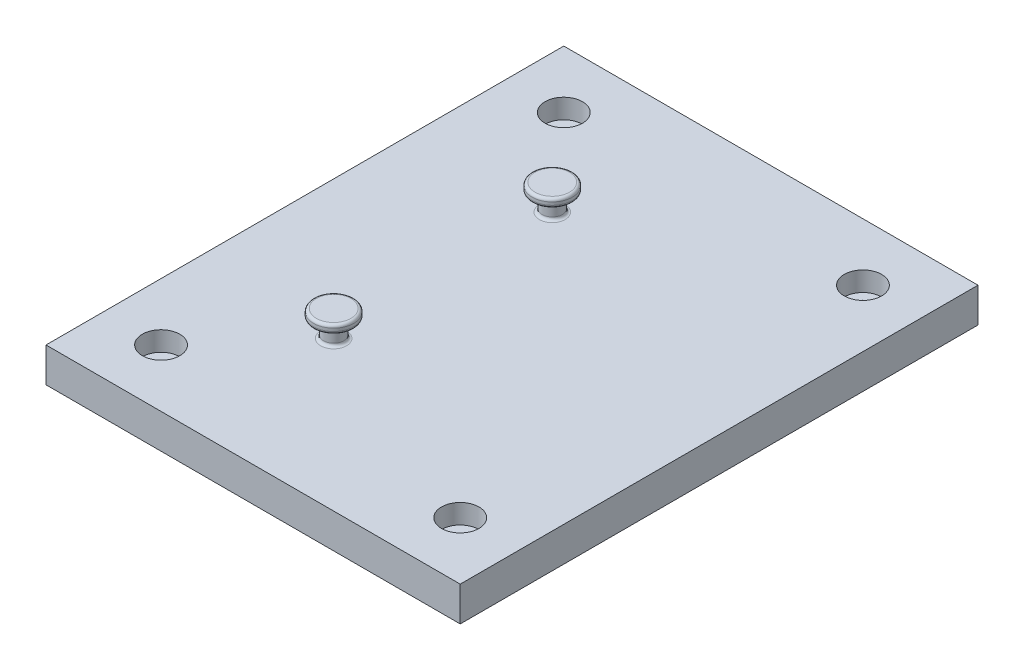
ISO-10303-21;
HEADER;
FILE_DESCRIPTION(('STEP AP214'),'2;1');
FILE_NAME('part.step','',(''),(''),'','','');
FILE_SCHEMA(('AUTOMOTIVE_DESIGN { 1 0 10303 214 1 1 1 1 }'));
ENDSEC;
DATA;
#1=APPLICATION_CONTEXT('core data for automotive mechanical design processes');
#2=APPLICATION_PROTOCOL_DEFINITION('international standard','automotive_design',2000,#1);
#3=PRODUCT_CONTEXT('',#1,'mechanical');
#4=PRODUCT('Part','Part','',(#3));
#5=PRODUCT_RELATED_PRODUCT_CATEGORY('part','',(#4));
#6=PRODUCT_DEFINITION_FORMATION('','',#4);
#7=PRODUCT_DEFINITION_CONTEXT('part definition',#1,'design');
#8=PRODUCT_DEFINITION('design','',#6,#7);
#9=PRODUCT_DEFINITION_SHAPE('','',#8);
#10=(LENGTH_UNIT() NAMED_UNIT(*) SI_UNIT(.MILLI.,.METRE.));
#11=(NAMED_UNIT(*) PLANE_ANGLE_UNIT() SI_UNIT($,.RADIAN.));
#12=(NAMED_UNIT(*) SI_UNIT($,.STERADIAN.) SOLID_ANGLE_UNIT());
#13=UNCERTAINTY_MEASURE_WITH_UNIT(LENGTH_MEASURE(1.E-05),#10,'distance_accuracy_value','');
#14=(GEOMETRIC_REPRESENTATION_CONTEXT(3) GLOBAL_UNCERTAINTY_ASSIGNED_CONTEXT((#13)) GLOBAL_UNIT_ASSIGNED_CONTEXT((#10,
#11,#12)) REPRESENTATION_CONTEXT('',''));
#15=CARTESIAN_POINT('',(0.,0.,0.));
#16=DIRECTION('',(0.,0.,1.));
#17=DIRECTION('',(1.,0.,0.));
#18=AXIS2_PLACEMENT_3D('',#15,#16,#17);
#19=CARTESIAN_POINT('',(-36.,6.,-45.));
#20=DIRECTION('',(1.,0.,0.));
#21=DIRECTION('',(0.,0.,-1.));
#22=AXIS2_PLACEMENT_3D('',#19,#20,#21);
#23=PLANE('',#22);
#24=DIRECTION('',(0.,0.,1.));
#25=VECTOR('',#24,1.);
#26=CARTESIAN_POINT('',(-36.,0.,-45.));
#27=LINE('',#26,#25);
#28=CARTESIAN_POINT('',(-36.,0.,-45.));
#29=VERTEX_POINT('',#28);
#30=CARTESIAN_POINT('',(-36.,0.,45.));
#31=VERTEX_POINT('',#30);
#32=EDGE_CURVE('E122',#29,#31,#27,.T.);
#33=ORIENTED_EDGE('',*,*,#32,.T.);
#34=DIRECTION('',(0.,-1.,0.));
#35=VECTOR('',#34,1.);
#36=CARTESIAN_POINT('',(-36.,6.,45.));
#37=LINE('',#36,#35);
#38=CARTESIAN_POINT('',(-36.,6.,45.));
#39=VERTEX_POINT('',#38);
#40=EDGE_CURVE('E111',#39,#31,#37,.T.);
#41=ORIENTED_EDGE('',*,*,#40,.F.);
#42=DIRECTION('',(0.,0.,1.));
#43=VECTOR('',#42,1.);
#44=CARTESIAN_POINT('',(-36.,6.,-45.));
#45=LINE('',#44,#43);
#46=CARTESIAN_POINT('',(-36.,6.,-45.));
#47=VERTEX_POINT('',#46);
#48=EDGE_CURVE('E103',#47,#39,#45,.T.);
#49=ORIENTED_EDGE('',*,*,#48,.F.);
#50=DIRECTION('',(0.,-1.,0.));
#51=VECTOR('',#50,1.);
#52=CARTESIAN_POINT('',(-36.,6.,-45.));
#53=LINE('',#52,#51);
#54=EDGE_CURVE('E118',#47,#29,#53,.T.);
#55=ORIENTED_EDGE('',*,*,#54,.T.);
#56=EDGE_LOOP('',(#33,#41,#49,#55));
#57=FACE_BOUND('',#56,.T.);
#58=ADVANCED_FACE('F47',(#57),#23,.F.);
#59=CARTESIAN_POINT('',(-36.,6.,45.));
#60=DIRECTION('',(0.,0.,-1.));
#61=DIRECTION('',(-1.,0.,0.));
#62=AXIS2_PLACEMENT_3D('',#59,#60,#61);
#63=PLANE('',#62);
#64=DIRECTION('',(1.,0.,0.));
#65=VECTOR('',#64,1.);
#66=CARTESIAN_POINT('',(-36.,0.,45.));
#67=LINE('',#66,#65);
#68=CARTESIAN_POINT('',(36.,0.,45.));
#69=VERTEX_POINT('',#68);
#70=EDGE_CURVE('E109',#31,#69,#67,.T.);
#71=ORIENTED_EDGE('',*,*,#70,.T.);
#72=DIRECTION('',(0.,-1.,0.));
#73=VECTOR('',#72,1.);
#74=CARTESIAN_POINT('',(36.,6.,45.));
#75=LINE('',#74,#73);
#76=CARTESIAN_POINT('',(36.,6.,45.));
#77=VERTEX_POINT('',#76);
#78=EDGE_CURVE('E107',#77,#69,#75,.T.);
#79=ORIENTED_EDGE('',*,*,#78,.F.);
#80=DIRECTION('',(1.,0.,0.));
#81=VECTOR('',#80,1.);
#82=CARTESIAN_POINT('',(-36.,6.,45.));
#83=LINE('',#82,#81);
#84=EDGE_CURVE('E98',#39,#77,#83,.T.);
#85=ORIENTED_EDGE('',*,*,#84,.F.);
#86=ORIENTED_EDGE('',*,*,#40,.T.);
#87=EDGE_LOOP('',(#71,#79,#85,#86));
#88=FACE_BOUND('',#87,.T.);
#89=ADVANCED_FACE('F108',(#88),#63,.F.);
#90=CARTESIAN_POINT('',(36.,6.,-45.));
#91=DIRECTION('',(-1.,0.,0.));
#92=DIRECTION('',(0.,0.,1.));
#93=AXIS2_PLACEMENT_3D('',#90,#91,#92);
#94=PLANE('',#93);
#95=DIRECTION('',(0.,0.,-1.));
#96=VECTOR('',#95,1.);
#97=CARTESIAN_POINT('',(36.,0.,-45.));
#98=LINE('',#97,#96);
#99=CARTESIAN_POINT('',(36.,0.,-45.));
#100=VERTEX_POINT('',#99);
#101=EDGE_CURVE('E84',#69,#100,#98,.T.);
#102=ORIENTED_EDGE('',*,*,#101,.T.);
#103=DIRECTION('',(0.,-1.,0.));
#104=VECTOR('',#103,1.);
#105=CARTESIAN_POINT('',(36.,6.,-45.));
#106=LINE('',#105,#104);
#107=CARTESIAN_POINT('',(36.,6.,-45.));
#108=VERTEX_POINT('',#107);
#109=EDGE_CURVE('E112',#108,#100,#106,.T.);
#110=ORIENTED_EDGE('',*,*,#109,.F.);
#111=DIRECTION('',(0.,0.,-1.));
#112=VECTOR('',#111,1.);
#113=CARTESIAN_POINT('',(36.,6.,-45.));
#114=LINE('',#113,#112);
#115=EDGE_CURVE('E101',#77,#108,#114,.T.);
#116=ORIENTED_EDGE('',*,*,#115,.F.);
#117=ORIENTED_EDGE('',*,*,#78,.T.);
#118=EDGE_LOOP('',(#102,#110,#116,#117));
#119=FACE_BOUND('',#118,.T.);
#120=ADVANCED_FACE('F114',(#119),#94,.F.);
#121=CARTESIAN_POINT('',(-36.,6.,-45.));
#122=DIRECTION('',(0.,0.,1.));
#123=DIRECTION('',(1.,0.,0.));
#124=AXIS2_PLACEMENT_3D('',#121,#122,#123);
#125=PLANE('',#124);
#126=DIRECTION('',(-1.,0.,0.));
#127=VECTOR('',#126,1.);
#128=CARTESIAN_POINT('',(-36.,0.,-45.));
#129=LINE('',#128,#127);
#130=EDGE_CURVE('E90',#100,#29,#129,.T.);
#131=ORIENTED_EDGE('',*,*,#130,.T.);
#132=ORIENTED_EDGE('',*,*,#54,.F.);
#133=DIRECTION('',(-1.,0.,0.));
#134=VECTOR('',#133,1.);
#135=CARTESIAN_POINT('',(-36.,6.,-45.));
#136=LINE('',#135,#134);
#137=EDGE_CURVE('E67',#108,#47,#136,.T.);
#138=ORIENTED_EDGE('',*,*,#137,.F.);
#139=ORIENTED_EDGE('',*,*,#109,.T.);
#140=EDGE_LOOP('',(#131,#132,#138,#139));
#141=FACE_BOUND('',#140,.T.);
#142=ADVANCED_FACE('F297',(#141),#125,.F.);
#143=CARTESIAN_POINT('',(0.,6.,0.));
#144=DIRECTION('',(0.,1.,0.));
#145=DIRECTION('',(0.,0.,1.));
#146=AXIS2_PLACEMENT_3D('',#143,#144,#145);
#147=PLANE('',#146);
#148=CARTESIAN_POINT('',(-26.,6.,-35.));
#149=DIRECTION('',(0.,1.,0.));
#150=DIRECTION('',(0.,0.,1.));
#151=AXIS2_PLACEMENT_3D('',#148,#149,#150);
#152=CIRCLE('',#151,3.25);
#153=CARTESIAN_POINT('',(-26.,6.,-31.75));
#154=VERTEX_POINT('',#153);
#155=EDGE_CURVE('E498',#154,#154,#152,.T.);
#156=ORIENTED_EDGE('',*,*,#155,.F.);
#157=EDGE_LOOP('',(#156));
#158=FACE_BOUND('',#157,.T.);
#159=CARTESIAN_POINT('',(26.,6.,-35.));
#160=DIRECTION('',(0.,1.,0.));
#161=DIRECTION('',(0.,0.,1.));
#162=AXIS2_PLACEMENT_3D('',#159,#160,#161);
#163=CIRCLE('',#162,3.25);
#164=CARTESIAN_POINT('',(26.,6.,-31.75));
#165=VERTEX_POINT('',#164);
#166=EDGE_CURVE('E212',#165,#165,#163,.T.);
#167=ORIENTED_EDGE('',*,*,#166,.F.);
#168=EDGE_LOOP('',(#167));
#169=FACE_BOUND('',#168,.T.);
#170=CARTESIAN_POINT('',(26.,6.,35.));
#171=DIRECTION('',(0.,1.,0.));
#172=DIRECTION('',(0.,0.,1.));
#173=AXIS2_PLACEMENT_3D('',#170,#171,#172);
#174=CIRCLE('',#173,3.25);
#175=CARTESIAN_POINT('',(26.,6.,38.25));
#176=VERTEX_POINT('',#175);
#177=EDGE_CURVE('E196',#176,#176,#174,.T.);
#178=ORIENTED_EDGE('',*,*,#177,.F.);
#179=EDGE_LOOP('',(#178));
#180=FACE_BOUND('',#179,.T.);
#181=CARTESIAN_POINT('',(-26.,6.,35.));
#182=DIRECTION('',(0.,1.,0.));
#183=DIRECTION('',(0.,0.,1.));
#184=AXIS2_PLACEMENT_3D('',#181,#182,#183);
#185=CIRCLE('',#184,3.25);
#186=CARTESIAN_POINT('',(-26.,6.,38.25));
#187=VERTEX_POINT('',#186);
#188=EDGE_CURVE('E191',#187,#187,#185,.T.);
#189=ORIENTED_EDGE('',*,*,#188,.F.);
#190=EDGE_LOOP('',(#189));
#191=FACE_BOUND('',#190,.T.);
#192=CARTESIAN_POINT('',(-12.,6.,-19.));
#193=DIRECTION('',(0.,1.,0.));
#194=DIRECTION('',(0.,0.,1.));
#195=AXIS2_PLACEMENT_3D('',#192,#193,#194);
#196=CIRCLE('',#195,2.25);
#197=CARTESIAN_POINT('',(-12.,6.,-16.75));
#198=VERTEX_POINT('',#197);
#199=EDGE_CURVE('E58',#198,#198,#196,.F.);
#200=ORIENTED_EDGE('',*,*,#199,.T.);
#201=EDGE_LOOP('',(#200));
#202=FACE_BOUND('',#201,.T.);
#203=CARTESIAN_POINT('',(-12.,6.,19.));
#204=DIRECTION('',(0.,1.,0.));
#205=DIRECTION('',(0.,0.,1.));
#206=AXIS2_PLACEMENT_3D('',#203,#204,#205);
#207=CIRCLE('',#206,2.25);
#208=CARTESIAN_POINT('',(-12.,6.,21.25));
#209=VERTEX_POINT('',#208);
#210=EDGE_CURVE('E175',#209,#209,#207,.F.);
#211=ORIENTED_EDGE('',*,*,#210,.T.);
#212=EDGE_LOOP('',(#211));
#213=FACE_BOUND('',#212,.T.);
#214=ORIENTED_EDGE('',*,*,#48,.T.);
#215=ORIENTED_EDGE('',*,*,#84,.T.);
#216=ORIENTED_EDGE('',*,*,#115,.T.);
#217=ORIENTED_EDGE('',*,*,#137,.T.);
#218=EDGE_LOOP('',(#214,#215,#216,#217));
#219=FACE_BOUND('',#218,.T.);
#220=ADVANCED_FACE('F99',(#158,#169,#180,#191,#202,#213,#219),#147,.T.);
#221=CARTESIAN_POINT('',(0.,0.,0.));
#222=DIRECTION('',(0.,1.,0.));
#223=DIRECTION('',(0.,0.,1.));
#224=AXIS2_PLACEMENT_3D('',#221,#222,#223);
#225=PLANE('',#224);
#226=CARTESIAN_POINT('',(-26.,0.,-35.));
#227=DIRECTION('',(0.,1.,0.));
#228=DIRECTION('',(0.,0.,1.));
#229=AXIS2_PLACEMENT_3D('',#226,#227,#228);
#230=CIRCLE('',#229,1.6);
#231=CARTESIAN_POINT('',(-26.,0.,-33.4));
#232=VERTEX_POINT('',#231);
#233=EDGE_CURVE('E51',#232,#232,#230,.T.);
#234=ORIENTED_EDGE('',*,*,#233,.T.);
#235=EDGE_LOOP('',(#234));
#236=FACE_BOUND('',#235,.T.);
#237=CARTESIAN_POINT('',(26.,0.,-35.));
#238=DIRECTION('',(0.,1.,0.));
#239=DIRECTION('',(0.,0.,1.));
#240=AXIS2_PLACEMENT_3D('',#237,#238,#239);
#241=CIRCLE('',#240,1.6);
#242=CARTESIAN_POINT('',(26.,0.,-33.4));
#243=VERTEX_POINT('',#242);
#244=EDGE_CURVE('E193',#243,#243,#241,.T.);
#245=ORIENTED_EDGE('',*,*,#244,.T.);
#246=EDGE_LOOP('',(#245));
#247=FACE_BOUND('',#246,.T.);
#248=CARTESIAN_POINT('',(26.,0.,35.));
#249=DIRECTION('',(0.,1.,0.));
#250=DIRECTION('',(0.,0.,1.));
#251=AXIS2_PLACEMENT_3D('',#248,#249,#250);
#252=CIRCLE('',#251,1.6);
#253=CARTESIAN_POINT('',(26.,0.,36.6));
#254=VERTEX_POINT('',#253);
#255=EDGE_CURVE('E188',#254,#254,#252,.T.);
#256=ORIENTED_EDGE('',*,*,#255,.T.);
#257=EDGE_LOOP('',(#256));
#258=FACE_BOUND('',#257,.T.);
#259=CARTESIAN_POINT('',(-26.,0.,35.));
#260=DIRECTION('',(0.,1.,0.));
#261=DIRECTION('',(0.,0.,1.));
#262=AXIS2_PLACEMENT_3D('',#259,#260,#261);
#263=CIRCLE('',#262,1.6);
#264=CARTESIAN_POINT('',(-26.,0.,36.6));
#265=VERTEX_POINT('',#264);
#266=EDGE_CURVE('E182',#265,#265,#263,.T.);
#267=ORIENTED_EDGE('',*,*,#266,.T.);
#268=EDGE_LOOP('',(#267));
#269=FACE_BOUND('',#268,.T.);
#270=ORIENTED_EDGE('',*,*,#32,.F.);
#271=ORIENTED_EDGE('',*,*,#130,.F.);
#272=ORIENTED_EDGE('',*,*,#101,.F.);
#273=ORIENTED_EDGE('',*,*,#70,.F.);
#274=EDGE_LOOP('',(#270,#271,#272,#273));
#275=FACE_BOUND('',#274,.T.);
#276=ADVANCED_FACE('F245',(#236,#247,#258,#269,#275),#225,.F.);
#277=CARTESIAN_POINT('',(-12.,9.,-19.));
#278=DIRECTION('',(0.,-1.,0.));
#279=DIRECTION('',(0.,0.,-1.));
#280=AXIS2_PLACEMENT_3D('',#277,#278,#279);
#281=CYLINDRICAL_SURFACE('',#280,1.75);
#282=CARTESIAN_POINT('',(-12.,6.5,-19.));
#283=DIRECTION('',(0.,1.,0.));
#284=DIRECTION('',(0.,0.,1.));
#285=AXIS2_PLACEMENT_3D('',#282,#283,#284);
#286=CIRCLE('',#285,1.75);
#287=CARTESIAN_POINT('',(-12.,6.5,-17.25));
#288=VERTEX_POINT('',#287);
#289=EDGE_CURVE('E171',#288,#288,#286,.T.);
#290=ORIENTED_EDGE('',*,*,#289,.T.);
#291=EDGE_LOOP('',(#290));
#292=FACE_BOUND('',#291,.T.);
#293=CARTESIAN_POINT('',(-12.,9.,-19.));
#294=DIRECTION('',(0.,1.,0.));
#295=DIRECTION('',(0.,0.,1.));
#296=AXIS2_PLACEMENT_3D('',#293,#294,#295);
#297=CIRCLE('',#296,1.75);
#298=CARTESIAN_POINT('',(-12.,9.,-17.25));
#299=VERTEX_POINT('',#298);
#300=EDGE_CURVE('E186',#299,#299,#297,.T.);
#301=ORIENTED_EDGE('',*,*,#300,.F.);
#302=EDGE_LOOP('',(#301));
#303=FACE_BOUND('',#302,.T.);
#304=ADVANCED_FACE('F242',(#292,#303),#281,.T.);
#305=CARTESIAN_POINT('',(-12.,9.,19.));
#306=DIRECTION('',(0.,-1.,0.));
#307=DIRECTION('',(0.,0.,-1.));
#308=AXIS2_PLACEMENT_3D('',#305,#306,#307);
#309=CYLINDRICAL_SURFACE('',#308,1.75);
#310=CARTESIAN_POINT('',(-12.,6.5,19.));
#311=DIRECTION('',(0.,1.,0.));
#312=DIRECTION('',(0.,0.,1.));
#313=AXIS2_PLACEMENT_3D('',#310,#311,#312);
#314=CIRCLE('',#313,1.75);
#315=CARTESIAN_POINT('',(-12.,6.5,20.75));
#316=VERTEX_POINT('',#315);
#317=EDGE_CURVE('E11',#316,#316,#314,.T.);
#318=ORIENTED_EDGE('',*,*,#317,.T.);
#319=EDGE_LOOP('',(#318));
#320=FACE_BOUND('',#319,.T.);
#321=CARTESIAN_POINT('',(-12.,9.,19.));
#322=DIRECTION('',(0.,1.,0.));
#323=DIRECTION('',(0.,0.,1.));
#324=AXIS2_PLACEMENT_3D('',#321,#322,#323);
#325=CIRCLE('',#324,1.75);
#326=CARTESIAN_POINT('',(-12.,9.,20.75));
#327=VERTEX_POINT('',#326);
#328=EDGE_CURVE('E126',#327,#327,#325,.T.);
#329=ORIENTED_EDGE('',*,*,#328,.F.);
#330=EDGE_LOOP('',(#329));
#331=FACE_BOUND('',#330,.T.);
#332=ADVANCED_FACE('F244',(#320,#331),#309,.T.);
#333=CARTESIAN_POINT('',(-12.,10.5,19.));
#334=DIRECTION('',(0.,-1.,0.));
#335=DIRECTION('',(0.,0.,-1.));
#336=AXIS2_PLACEMENT_3D('',#333,#334,#335);
#337=CYLINDRICAL_SURFACE('',#336,3.5);
#338=CARTESIAN_POINT('',(-12.,10.,19.));
#339=DIRECTION('',(0.,1.,0.));
#340=DIRECTION('',(0.,0.,1.));
#341=AXIS2_PLACEMENT_3D('',#338,#339,#340);
#342=CIRCLE('',#341,3.5);
#343=CARTESIAN_POINT('',(-12.,10.,22.5));
#344=VERTEX_POINT('',#343);
#345=EDGE_CURVE('E163',#344,#344,#342,.F.);
#346=ORIENTED_EDGE('',*,*,#345,.T.);
#347=EDGE_LOOP('',(#346));
#348=FACE_BOUND('',#347,.T.);
#349=CARTESIAN_POINT('',(-12.,9.5,19.));
#350=DIRECTION('',(0.,1.,0.));
#351=DIRECTION('',(0.,0.,1.));
#352=AXIS2_PLACEMENT_3D('',#349,#350,#351);
#353=CIRCLE('',#352,3.5);
#354=CARTESIAN_POINT('',(-12.,9.5,22.5));
#355=VERTEX_POINT('',#354);
#356=EDGE_CURVE('E159',#355,#355,#353,.T.);
#357=ORIENTED_EDGE('',*,*,#356,.T.);
#358=EDGE_LOOP('',(#357));
#359=FACE_BOUND('',#358,.T.);
#360=ADVANCED_FACE('F252',(#348,#359),#337,.T.);
#361=CARTESIAN_POINT('',(-12.,10.5,19.));
#362=DIRECTION('',(0.,1.,0.));
#363=DIRECTION('',(0.,0.,1.));
#364=AXIS2_PLACEMENT_3D('',#361,#362,#363);
#365=PLANE('',#364);
#366=CARTESIAN_POINT('',(-12.,10.5,19.));
#367=DIRECTION('',(0.,1.,0.));
#368=DIRECTION('',(0.,0.,1.));
#369=AXIS2_PLACEMENT_3D('',#366,#367,#368);
#370=CIRCLE('',#369,3.);
#371=CARTESIAN_POINT('',(-12.,10.5,22.));
#372=VERTEX_POINT('',#371);
#373=EDGE_CURVE('E155',#372,#372,#370,.T.);
#374=ORIENTED_EDGE('',*,*,#373,.T.);
#375=EDGE_LOOP('',(#374));
#376=FACE_BOUND('',#375,.T.);
#377=ADVANCED_FACE('F308',(#376),#365,.T.);
#378=CARTESIAN_POINT('',(-12.,9.,19.));
#379=DIRECTION('',(0.,1.,0.));
#380=DIRECTION('',(0.,0.,1.));
#381=AXIS2_PLACEMENT_3D('',#378,#379,#380);
#382=PLANE('',#381);
#383=CARTESIAN_POINT('',(-12.,9.,19.));
#384=DIRECTION('',(0.,1.,0.));
#385=DIRECTION('',(0.,0.,1.));
#386=AXIS2_PLACEMENT_3D('',#383,#384,#385);
#387=CIRCLE('',#386,3.);
#388=CARTESIAN_POINT('',(-12.,9.,22.));
#389=VERTEX_POINT('',#388);
#390=EDGE_CURVE('E167',#389,#389,#387,.F.);
#391=ORIENTED_EDGE('',*,*,#390,.T.);
#392=EDGE_LOOP('',(#391));
#393=FACE_BOUND('',#392,.T.);
#394=ORIENTED_EDGE('',*,*,#328,.T.);
#395=EDGE_LOOP('',(#394));
#396=FACE_BOUND('',#395,.T.);
#397=ADVANCED_FACE('F305',(#393,#396),#382,.F.);
#398=CARTESIAN_POINT('',(-12.,10.5,-19.));
#399=DIRECTION('',(0.,-1.,0.));
#400=DIRECTION('',(0.,0.,-1.));
#401=AXIS2_PLACEMENT_3D('',#398,#399,#400);
#402=CYLINDRICAL_SURFACE('',#401,3.5);
#403=CARTESIAN_POINT('',(-12.,10.,-19.));
#404=DIRECTION('',(0.,1.,0.));
#405=DIRECTION('',(0.,0.,1.));
#406=AXIS2_PLACEMENT_3D('',#403,#404,#405);
#407=CIRCLE('',#406,3.5);
#408=CARTESIAN_POINT('',(-12.,10.,-15.5));
#409=VERTEX_POINT('',#408);
#410=EDGE_CURVE('E147',#409,#409,#407,.F.);
#411=ORIENTED_EDGE('',*,*,#410,.T.);
#412=EDGE_LOOP('',(#411));
#413=FACE_BOUND('',#412,.T.);
#414=CARTESIAN_POINT('',(-12.,9.5,-19.));
#415=DIRECTION('',(0.,1.,0.));
#416=DIRECTION('',(0.,0.,1.));
#417=AXIS2_PLACEMENT_3D('',#414,#415,#416);
#418=CIRCLE('',#417,3.5);
#419=CARTESIAN_POINT('',(-12.,9.5,-15.5));
#420=VERTEX_POINT('',#419);
#421=EDGE_CURVE('E143',#420,#420,#418,.T.);
#422=ORIENTED_EDGE('',*,*,#421,.T.);
#423=EDGE_LOOP('',(#422));
#424=FACE_BOUND('',#423,.T.);
#425=ADVANCED_FACE('F307',(#413,#424),#402,.T.);
#426=CARTESIAN_POINT('',(-12.,10.5,-19.));
#427=DIRECTION('',(0.,1.,0.));
#428=DIRECTION('',(0.,0.,1.));
#429=AXIS2_PLACEMENT_3D('',#426,#427,#428);
#430=PLANE('',#429);
#431=CARTESIAN_POINT('',(-12.,10.5,-19.));
#432=DIRECTION('',(0.,1.,0.));
#433=DIRECTION('',(0.,0.,1.));
#434=AXIS2_PLACEMENT_3D('',#431,#432,#433);
#435=CIRCLE('',#434,3.);
#436=CARTESIAN_POINT('',(-12.,10.5,-16.));
#437=VERTEX_POINT('',#436);
#438=EDGE_CURVE('E139',#437,#437,#435,.T.);
#439=ORIENTED_EDGE('',*,*,#438,.T.);
#440=EDGE_LOOP('',(#439));
#441=FACE_BOUND('',#440,.T.);
#442=ADVANCED_FACE('F315',(#441),#430,.T.);
#443=CARTESIAN_POINT('',(-12.,9.,-19.));
#444=DIRECTION('',(0.,1.,0.));
#445=DIRECTION('',(0.,0.,1.));
#446=AXIS2_PLACEMENT_3D('',#443,#444,#445);
#447=PLANE('',#446);
#448=CARTESIAN_POINT('',(-12.,9.,-19.));
#449=DIRECTION('',(0.,1.,0.));
#450=DIRECTION('',(0.,0.,1.));
#451=AXIS2_PLACEMENT_3D('',#448,#449,#450);
#452=CIRCLE('',#451,3.);
#453=CARTESIAN_POINT('',(-12.,9.,-16.));
#454=VERTEX_POINT('',#453);
#455=EDGE_CURVE('E151',#454,#454,#452,.F.);
#456=ORIENTED_EDGE('',*,*,#455,.T.);
#457=EDGE_LOOP('',(#456));
#458=FACE_BOUND('',#457,.T.);
#459=ORIENTED_EDGE('',*,*,#300,.T.);
#460=EDGE_LOOP('',(#459));
#461=FACE_BOUND('',#460,.T.);
#462=ADVANCED_FACE('F240',(#458,#461),#447,.F.);
#463=CARTESIAN_POINT('',(-12.,10.,-19.));
#464=DIRECTION('',(0.,1.,0.));
#465=DIRECTION('',(0.,0.,1.));
#466=AXIS2_PLACEMENT_3D('',#463,#464,#465);
#467=TOROIDAL_SURFACE('',#466,3.,0.5);
#468=ORIENTED_EDGE('',*,*,#410,.F.);
#469=EDGE_LOOP('',(#468));
#470=FACE_BOUND('',#469,.T.);
#471=ORIENTED_EDGE('',*,*,#438,.F.);
#472=EDGE_LOOP('',(#471));
#473=FACE_BOUND('',#472,.T.);
#474=ADVANCED_FACE('F268',(#470,#473),#467,.T.);
#475=CARTESIAN_POINT('',(-12.,9.5,-19.));
#476=DIRECTION('',(0.,1.,0.));
#477=DIRECTION('',(0.,0.,1.));
#478=AXIS2_PLACEMENT_3D('',#475,#476,#477);
#479=TOROIDAL_SURFACE('',#478,3.,0.5);
#480=ORIENTED_EDGE('',*,*,#455,.F.);
#481=EDGE_LOOP('',(#480));
#482=FACE_BOUND('',#481,.T.);
#483=ORIENTED_EDGE('',*,*,#421,.F.);
#484=EDGE_LOOP('',(#483));
#485=FACE_BOUND('',#484,.T.);
#486=ADVANCED_FACE('F271',(#482,#485),#479,.T.);
#487=CARTESIAN_POINT('',(-12.,10.,19.));
#488=DIRECTION('',(0.,1.,0.));
#489=DIRECTION('',(0.,0.,1.));
#490=AXIS2_PLACEMENT_3D('',#487,#488,#489);
#491=TOROIDAL_SURFACE('',#490,3.,0.5);
#492=ORIENTED_EDGE('',*,*,#345,.F.);
#493=EDGE_LOOP('',(#492));
#494=FACE_BOUND('',#493,.T.);
#495=ORIENTED_EDGE('',*,*,#373,.F.);
#496=EDGE_LOOP('',(#495));
#497=FACE_BOUND('',#496,.T.);
#498=ADVANCED_FACE('F275',(#494,#497),#491,.T.);
#499=CARTESIAN_POINT('',(-12.,9.5,19.));
#500=DIRECTION('',(0.,1.,0.));
#501=DIRECTION('',(0.,0.,1.));
#502=AXIS2_PLACEMENT_3D('',#499,#500,#501);
#503=TOROIDAL_SURFACE('',#502,3.,0.5);
#504=ORIENTED_EDGE('',*,*,#390,.F.);
#505=EDGE_LOOP('',(#504));
#506=FACE_BOUND('',#505,.T.);
#507=ORIENTED_EDGE('',*,*,#356,.F.);
#508=EDGE_LOOP('',(#507));
#509=FACE_BOUND('',#508,.T.);
#510=ADVANCED_FACE('F279',(#506,#509),#503,.T.);
#511=CARTESIAN_POINT('',(-12.,6.5,-19.));
#512=DIRECTION('',(0.,1.,0.));
#513=DIRECTION('',(0.,0.,1.));
#514=AXIS2_PLACEMENT_3D('',#511,#512,#513);
#515=TOROIDAL_SURFACE('',#514,2.25,0.5);
#516=ORIENTED_EDGE('',*,*,#199,.F.);
#517=EDGE_LOOP('',(#516));
#518=FACE_BOUND('',#517,.T.);
#519=ORIENTED_EDGE('',*,*,#289,.F.);
#520=EDGE_LOOP('',(#519));
#521=FACE_BOUND('',#520,.T.);
#522=ADVANCED_FACE('F282',(#518,#521),#515,.F.);
#523=CARTESIAN_POINT('',(-12.,6.5,19.));
#524=DIRECTION('',(0.,1.,0.));
#525=DIRECTION('',(0.,0.,1.));
#526=AXIS2_PLACEMENT_3D('',#523,#524,#525);
#527=TOROIDAL_SURFACE('',#526,2.25,0.5);
#528=ORIENTED_EDGE('',*,*,#210,.F.);
#529=EDGE_LOOP('',(#528));
#530=FACE_BOUND('',#529,.T.);
#531=ORIENTED_EDGE('',*,*,#317,.F.);
#532=EDGE_LOOP('',(#531));
#533=FACE_BOUND('',#532,.T.);
#534=ADVANCED_FACE('F49',(#530,#533),#527,.F.);
#535=CARTESIAN_POINT('',(-26.,6.,35.));
#536=DIRECTION('',(0.,1.,0.));
#537=DIRECTION('',(0.,0.,1.));
#538=AXIS2_PLACEMENT_3D('',#535,#536,#537);
#539=CYLINDRICAL_SURFACE('',#538,1.6);
#540=CARTESIAN_POINT('',(-26.,2.6,35.));
#541=DIRECTION('',(0.,1.,0.));
#542=DIRECTION('',(0.,0.,1.));
#543=AXIS2_PLACEMENT_3D('',#540,#541,#542);
#544=CIRCLE('',#543,1.6);
#545=CARTESIAN_POINT('',(-26.,2.6,36.6));
#546=VERTEX_POINT('',#545);
#547=EDGE_CURVE('E187',#546,#546,#544,.T.);
#548=ORIENTED_EDGE('',*,*,#547,.T.);
#549=EDGE_LOOP('',(#548));
#550=FACE_BOUND('',#549,.T.);
#551=ORIENTED_EDGE('',*,*,#266,.F.);
#552=EDGE_LOOP('',(#551));
#553=FACE_BOUND('',#552,.T.);
#554=ADVANCED_FACE('F289',(#550,#553),#539,.F.);
#555=CARTESIAN_POINT('',(-24.4,2.6,35.));
#556=DIRECTION('',(0.,-1.,0.));
#557=DIRECTION('',(0.,0.,-1.));
#558=AXIS2_PLACEMENT_3D('',#555,#556,#557);
#559=PLANE('',#558);
#560=ORIENTED_EDGE('',*,*,#547,.F.);
#561=EDGE_LOOP('',(#560));
#562=FACE_BOUND('',#561,.T.);
#563=CARTESIAN_POINT('',(-26.,2.6,35.));
#564=DIRECTION('',(0.,1.,0.));
#565=DIRECTION('',(0.,0.,1.));
#566=AXIS2_PLACEMENT_3D('',#563,#564,#565);
#567=CIRCLE('',#566,3.25);
#568=CARTESIAN_POINT('',(-26.,2.6,38.25));
#569=VERTEX_POINT('',#568);
#570=EDGE_CURVE('E225',#569,#569,#567,.T.);
#571=ORIENTED_EDGE('',*,*,#570,.T.);
#572=EDGE_LOOP('',(#571));
#573=FACE_BOUND('',#572,.T.);
#574=ADVANCED_FACE('F381',(#562,#573),#559,.F.);
#575=CARTESIAN_POINT('',(-26.,6.,35.));
#576=DIRECTION('',(0.,1.,0.));
#577=DIRECTION('',(0.,0.,1.));
#578=AXIS2_PLACEMENT_3D('',#575,#576,#577);
#579=CYLINDRICAL_SURFACE('',#578,3.25);
#580=ORIENTED_EDGE('',*,*,#570,.F.);
#581=EDGE_LOOP('',(#580));
#582=FACE_BOUND('',#581,.T.);
#583=ORIENTED_EDGE('',*,*,#188,.T.);
#584=EDGE_LOOP('',(#583));
#585=FACE_BOUND('',#584,.T.);
#586=ADVANCED_FACE('F390',(#582,#585),#579,.F.);
#587=CARTESIAN_POINT('',(26.,6.,35.));
#588=DIRECTION('',(0.,1.,0.));
#589=DIRECTION('',(0.,0.,1.));
#590=AXIS2_PLACEMENT_3D('',#587,#588,#589);
#591=CYLINDRICAL_SURFACE('',#590,1.6);
#592=CARTESIAN_POINT('',(26.,2.6,35.));
#593=DIRECTION('',(0.,1.,0.));
#594=DIRECTION('',(0.,0.,1.));
#595=AXIS2_PLACEMENT_3D('',#592,#593,#594);
#596=CIRCLE('',#595,1.6);
#597=CARTESIAN_POINT('',(26.,2.6,36.6));
#598=VERTEX_POINT('',#597);
#599=EDGE_CURVE('E192',#598,#598,#596,.T.);
#600=ORIENTED_EDGE('',*,*,#599,.T.);
#601=EDGE_LOOP('',(#600));
#602=FACE_BOUND('',#601,.T.);
#603=ORIENTED_EDGE('',*,*,#255,.F.);
#604=EDGE_LOOP('',(#603));
#605=FACE_BOUND('',#604,.T.);
#606=ADVANCED_FACE('F400',(#602,#605),#591,.F.);
#607=CARTESIAN_POINT('',(27.6,2.6,35.));
#608=DIRECTION('',(0.,-1.,0.));
#609=DIRECTION('',(0.,0.,-1.));
#610=AXIS2_PLACEMENT_3D('',#607,#608,#609);
#611=PLANE('',#610);
#612=ORIENTED_EDGE('',*,*,#599,.F.);
#613=EDGE_LOOP('',(#612));
#614=FACE_BOUND('',#613,.T.);
#615=CARTESIAN_POINT('',(26.,2.6,35.));
#616=DIRECTION('',(0.,1.,0.));
#617=DIRECTION('',(0.,0.,1.));
#618=AXIS2_PLACEMENT_3D('',#615,#616,#617);
#619=CIRCLE('',#618,3.25);
#620=CARTESIAN_POINT('',(26.,2.6,38.25));
#621=VERTEX_POINT('',#620);
#622=EDGE_CURVE('E203',#621,#621,#619,.T.);
#623=ORIENTED_EDGE('',*,*,#622,.T.);
#624=EDGE_LOOP('',(#623));
#625=FACE_BOUND('',#624,.T.);
#626=ADVANCED_FACE('F410',(#614,#625),#611,.F.);
#627=CARTESIAN_POINT('',(26.,6.,35.));
#628=DIRECTION('',(0.,1.,0.));
#629=DIRECTION('',(0.,0.,1.));
#630=AXIS2_PLACEMENT_3D('',#627,#628,#629);
#631=CYLINDRICAL_SURFACE('',#630,3.25);
#632=ORIENTED_EDGE('',*,*,#622,.F.);
#633=EDGE_LOOP('',(#632));
#634=FACE_BOUND('',#633,.T.);
#635=ORIENTED_EDGE('',*,*,#177,.T.);
#636=EDGE_LOOP('',(#635));
#637=FACE_BOUND('',#636,.T.);
#638=ADVANCED_FACE('F420',(#634,#637),#631,.F.);
#639=CARTESIAN_POINT('',(26.,6.,-35.));
#640=DIRECTION('',(0.,1.,0.));
#641=DIRECTION('',(0.,0.,1.));
#642=AXIS2_PLACEMENT_3D('',#639,#640,#641);
#643=CYLINDRICAL_SURFACE('',#642,1.6);
#644=CARTESIAN_POINT('',(26.,2.6,-35.));
#645=DIRECTION('',(0.,1.,0.));
#646=DIRECTION('',(0.,0.,1.));
#647=AXIS2_PLACEMENT_3D('',#644,#645,#646);
#648=CIRCLE('',#647,1.6);
#649=CARTESIAN_POINT('',(26.,2.6,-33.4));
#650=VERTEX_POINT('',#649);
#651=EDGE_CURVE('E197',#650,#650,#648,.T.);
#652=ORIENTED_EDGE('',*,*,#651,.T.);
#653=EDGE_LOOP('',(#652));
#654=FACE_BOUND('',#653,.T.);
#655=ORIENTED_EDGE('',*,*,#244,.F.);
#656=EDGE_LOOP('',(#655));
#657=FACE_BOUND('',#656,.T.);
#658=ADVANCED_FACE('F430',(#654,#657),#643,.F.);
#659=CARTESIAN_POINT('',(27.6,2.6,-35.));
#660=DIRECTION('',(0.,-1.,0.));
#661=DIRECTION('',(0.,0.,-1.));
#662=AXIS2_PLACEMENT_3D('',#659,#660,#661);
#663=PLANE('',#662);
#664=ORIENTED_EDGE('',*,*,#651,.F.);
#665=EDGE_LOOP('',(#664));
#666=FACE_BOUND('',#665,.T.);
#667=CARTESIAN_POINT('',(26.,2.6,-35.));
#668=DIRECTION('',(0.,1.,0.));
#669=DIRECTION('',(0.,0.,1.));
#670=AXIS2_PLACEMENT_3D('',#667,#668,#669);
#671=CIRCLE('',#670,3.25);
#672=CARTESIAN_POINT('',(26.,2.6,-31.75));
#673=VERTEX_POINT('',#672);
#674=EDGE_CURVE('E206',#673,#673,#671,.T.);
#675=ORIENTED_EDGE('',*,*,#674,.T.);
#676=EDGE_LOOP('',(#675));
#677=FACE_BOUND('',#676,.T.);
#678=ADVANCED_FACE('F440',(#666,#677),#663,.F.);
#679=CARTESIAN_POINT('',(26.,6.,-35.));
#680=DIRECTION('',(0.,1.,0.));
#681=DIRECTION('',(0.,0.,1.));
#682=AXIS2_PLACEMENT_3D('',#679,#680,#681);
#683=CYLINDRICAL_SURFACE('',#682,3.25);
#684=ORIENTED_EDGE('',*,*,#674,.F.);
#685=EDGE_LOOP('',(#684));
#686=FACE_BOUND('',#685,.T.);
#687=ORIENTED_EDGE('',*,*,#166,.T.);
#688=EDGE_LOOP('',(#687));
#689=FACE_BOUND('',#688,.T.);
#690=ADVANCED_FACE('F449',(#686,#689),#683,.F.);
#691=CARTESIAN_POINT('',(-26.,6.,-35.));
#692=DIRECTION('',(0.,1.,0.));
#693=DIRECTION('',(0.,0.,1.));
#694=AXIS2_PLACEMENT_3D('',#691,#692,#693);
#695=CYLINDRICAL_SURFACE('',#694,1.6);
#696=CARTESIAN_POINT('',(-26.,2.6,-35.));
#697=DIRECTION('',(0.,1.,0.));
#698=DIRECTION('',(0.,0.,1.));
#699=AXIS2_PLACEMENT_3D('',#696,#697,#698);
#700=CIRCLE('',#699,1.6);
#701=CARTESIAN_POINT('',(-26.,2.6,-33.4));
#702=VERTEX_POINT('',#701);
#703=EDGE_CURVE('E502',#702,#702,#700,.T.);
#704=ORIENTED_EDGE('',*,*,#703,.T.);
#705=EDGE_LOOP('',(#704));
#706=FACE_BOUND('',#705,.T.);
#707=ORIENTED_EDGE('',*,*,#233,.F.);
#708=EDGE_LOOP('',(#707));
#709=FACE_BOUND('',#708,.T.);
#710=ADVANCED_FACE('F459',(#706,#709),#695,.F.);
#711=CARTESIAN_POINT('',(-24.4,2.6,-35.));
#712=DIRECTION('',(0.,-1.,0.));
#713=DIRECTION('',(0.,0.,-1.));
#714=AXIS2_PLACEMENT_3D('',#711,#712,#713);
#715=PLANE('',#714);
#716=ORIENTED_EDGE('',*,*,#703,.F.);
#717=EDGE_LOOP('',(#716));
#718=FACE_BOUND('',#717,.T.);
#719=CARTESIAN_POINT('',(-26.,2.6,-35.));
#720=DIRECTION('',(0.,1.,0.));
#721=DIRECTION('',(0.,0.,1.));
#722=AXIS2_PLACEMENT_3D('',#719,#720,#721);
#723=CIRCLE('',#722,3.25);
#724=CARTESIAN_POINT('',(-26.,2.6,-31.75));
#725=VERTEX_POINT('',#724);
#726=EDGE_CURVE('E495',#725,#725,#723,.T.);
#727=ORIENTED_EDGE('',*,*,#726,.T.);
#728=EDGE_LOOP('',(#727));
#729=FACE_BOUND('',#728,.T.);
#730=ADVANCED_FACE('F469',(#718,#729),#715,.F.);
#731=CARTESIAN_POINT('',(-26.,6.,-35.));
#732=DIRECTION('',(0.,1.,0.));
#733=DIRECTION('',(0.,0.,1.));
#734=AXIS2_PLACEMENT_3D('',#731,#732,#733);
#735=CYLINDRICAL_SURFACE('',#734,3.25);
#736=ORIENTED_EDGE('',*,*,#726,.F.);
#737=EDGE_LOOP('',(#736));
#738=FACE_BOUND('',#737,.T.);
#739=ORIENTED_EDGE('',*,*,#155,.T.);
#740=EDGE_LOOP('',(#739));
#741=FACE_BOUND('',#740,.T.);
#742=ADVANCED_FACE('F479',(#738,#741),#735,.F.);
#743=CLOSED_SHELL('',(#58,#89,#120,#142,#220,#276,#304,#332,#360,#377,#397,#425,#442,#462,#474,
#486,#498,#510,#522,#534,#554,#574,#586,#606,#626,#638,#658,#678,#690,#710,#730,#742));
#744=MANIFOLD_SOLID_BREP('B2',#743);
#745=ADVANCED_BREP_SHAPE_REPRESENTATION('',(#18,#744),#14);
#746=SHAPE_DEFINITION_REPRESENTATION(#9,#745);
ENDSEC;
END-ISO-10303-21;
